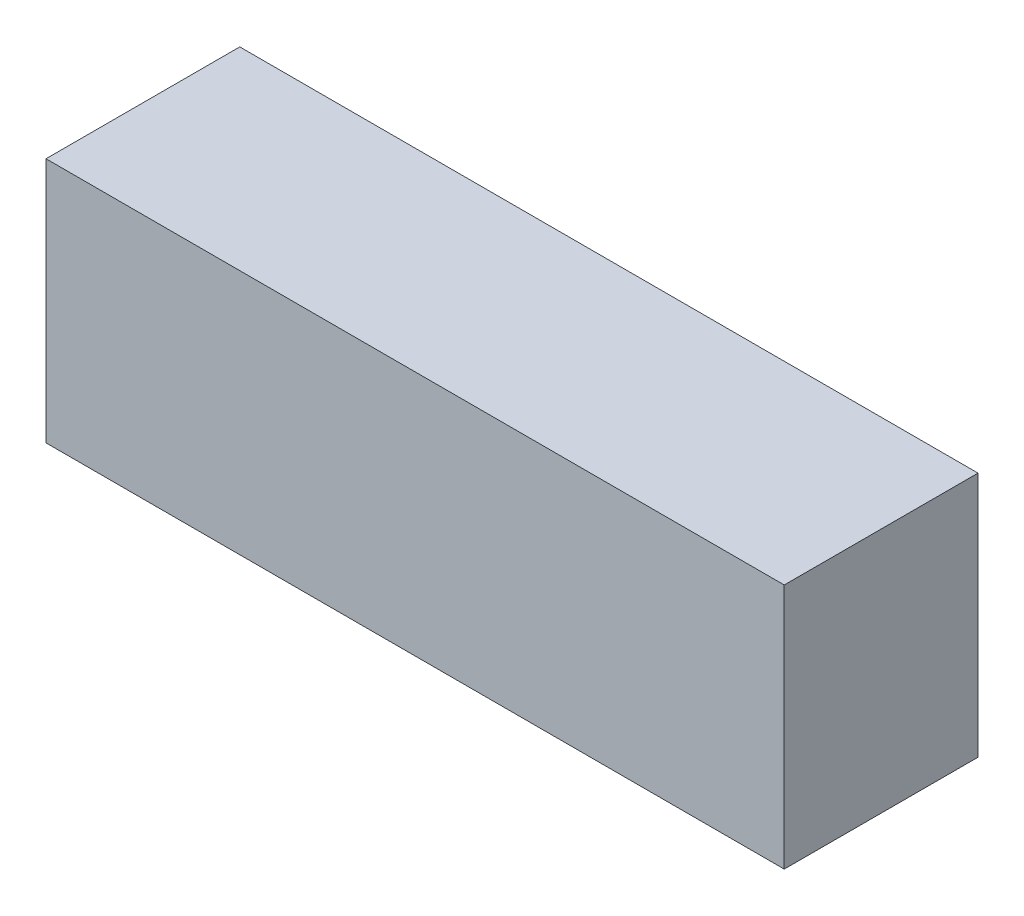
ISO-10303-21;
HEADER;
FILE_DESCRIPTION(('STEP AP214'),'2;1');
FILE_NAME('part.step','',(''),(''),'','','');
FILE_SCHEMA(('AUTOMOTIVE_DESIGN { 1 0 10303 214 1 1 1 1 }'));
ENDSEC;
DATA;
#1=APPLICATION_CONTEXT('core data for automotive mechanical design processes');
#2=APPLICATION_PROTOCOL_DEFINITION('international standard','automotive_design',2000,#1);
#3=PRODUCT_CONTEXT('',#1,'mechanical');
#4=PRODUCT('Part','Part','',(#3));
#5=PRODUCT_RELATED_PRODUCT_CATEGORY('part','',(#4));
#6=PRODUCT_DEFINITION_FORMATION('','',#4);
#7=PRODUCT_DEFINITION_CONTEXT('part definition',#1,'design');
#8=PRODUCT_DEFINITION('design','',#6,#7);
#9=PRODUCT_DEFINITION_SHAPE('','',#8);
#10=(LENGTH_UNIT() NAMED_UNIT(*) SI_UNIT(.MILLI.,.METRE.));
#11=(NAMED_UNIT(*) PLANE_ANGLE_UNIT() SI_UNIT($,.RADIAN.));
#12=(NAMED_UNIT(*) SI_UNIT($,.STERADIAN.) SOLID_ANGLE_UNIT());
#13=UNCERTAINTY_MEASURE_WITH_UNIT(LENGTH_MEASURE(1.E-05),#10,'distance_accuracy_value','');
#14=(GEOMETRIC_REPRESENTATION_CONTEXT(3) GLOBAL_UNCERTAINTY_ASSIGNED_CONTEXT((#13)) GLOBAL_UNIT_ASSIGNED_CONTEXT((#10,
#11,#12)) REPRESENTATION_CONTEXT('',''));
#15=CARTESIAN_POINT('',(0.,0.,0.));
#16=DIRECTION('',(0.,0.,1.));
#17=DIRECTION('',(1.,0.,0.));
#18=AXIS2_PLACEMENT_3D('',#15,#16,#17);
#19=CARTESIAN_POINT('',(1.905,0.635,1.));
#20=DIRECTION('',(0.,0.,1.));
#21=DIRECTION('',(1.,0.,0.));
#22=AXIS2_PLACEMENT_3D('',#19,#20,#21);
#23=PLANE('',#22);
#24=DIRECTION('',(1.,0.,0.));
#25=VECTOR('',#24,1.);
#26=CARTESIAN_POINT('',(1.905,-0.635,1.));
#27=LINE('',#26,#25);
#28=CARTESIAN_POINT('',(1.905,-0.635,1.));
#29=VERTEX_POINT('',#28);
#30=CARTESIAN_POINT('',(-1.905,-0.635,1.));
#31=VERTEX_POINT('',#30);
#32=EDGE_CURVE('E53',#29,#31,#27,.F.);
#33=ORIENTED_EDGE('',*,*,#32,.F.);
#34=DIRECTION('',(0.,1.,0.));
#35=VECTOR('',#34,1.);
#36=CARTESIAN_POINT('',(1.905,0.635,1.));
#37=LINE('',#36,#35);
#38=CARTESIAN_POINT('',(1.905,0.635,1.));
#39=VERTEX_POINT('',#38);
#40=EDGE_CURVE('E20',#29,#39,#37,.T.);
#41=ORIENTED_EDGE('',*,*,#40,.T.);
#42=DIRECTION('',(1.,0.,0.));
#43=VECTOR('',#42,1.);
#44=CARTESIAN_POINT('',(-1.905,0.635,1.));
#45=LINE('',#44,#43);
#46=CARTESIAN_POINT('',(-1.905,0.635,1.));
#47=VERTEX_POINT('',#46);
#48=EDGE_CURVE('E67',#47,#39,#45,.T.);
#49=ORIENTED_EDGE('',*,*,#48,.F.);
#50=DIRECTION('',(0.,1.,0.));
#51=VECTOR('',#50,1.);
#52=CARTESIAN_POINT('',(-1.905,-0.635,1.));
#53=LINE('',#52,#51);
#54=EDGE_CURVE('E58',#31,#47,#53,.T.);
#55=ORIENTED_EDGE('',*,*,#54,.F.);
#56=EDGE_LOOP('',(#33,#41,#49,#55));
#57=FACE_BOUND('',#56,.T.);
#58=ADVANCED_FACE('F17',(#57),#23,.T.);
#59=CARTESIAN_POINT('',(-1.905,0.635,0.));
#60=DIRECTION('',(0.,1.,0.));
#61=DIRECTION('',(0.,0.,1.));
#62=AXIS2_PLACEMENT_3D('',#59,#60,#61);
#63=PLANE('',#62);
#64=DIRECTION('',(0.,0.,-1.));
#65=VECTOR('',#64,1.);
#66=CARTESIAN_POINT('',(1.905,0.635,0.));
#67=LINE('',#66,#65);
#68=CARTESIAN_POINT('',(1.905,0.635,0.));
#69=VERTEX_POINT('',#68);
#70=EDGE_CURVE('E80',#69,#39,#67,.F.);
#71=ORIENTED_EDGE('',*,*,#70,.F.);
#72=DIRECTION('',(1.,0.,0.));
#73=VECTOR('',#72,1.);
#74=CARTESIAN_POINT('',(1.905,0.635,0.));
#75=LINE('',#74,#73);
#76=CARTESIAN_POINT('',(-1.905,0.635,0.));
#77=VERTEX_POINT('',#76);
#78=EDGE_CURVE('E75',#69,#77,#75,.F.);
#79=ORIENTED_EDGE('',*,*,#78,.T.);
#80=DIRECTION('',(0.,0.,1.));
#81=VECTOR('',#80,1.);
#82=CARTESIAN_POINT('',(-1.905,0.635,0.));
#83=LINE('',#82,#81);
#84=EDGE_CURVE('E63',#47,#77,#83,.F.);
#85=ORIENTED_EDGE('',*,*,#84,.F.);
#86=ORIENTED_EDGE('',*,*,#48,.T.);
#87=EDGE_LOOP('',(#71,#79,#85,#86));
#88=FACE_BOUND('',#87,.T.);
#89=ADVANCED_FACE('F74',(#88),#63,.T.);
#90=CARTESIAN_POINT('',(-1.905,-0.635,0.));
#91=DIRECTION('',(-1.,0.,0.));
#92=DIRECTION('',(0.,0.,1.));
#93=AXIS2_PLACEMENT_3D('',#90,#91,#92);
#94=PLANE('',#93);
#95=ORIENTED_EDGE('',*,*,#84,.T.);
#96=DIRECTION('',(0.,1.,0.));
#97=VECTOR('',#96,1.);
#98=CARTESIAN_POINT('',(-1.905,0.635,0.));
#99=LINE('',#98,#97);
#100=CARTESIAN_POINT('',(-1.905,-0.635,0.));
#101=VERTEX_POINT('',#100);
#102=EDGE_CURVE('E84',#77,#101,#99,.F.);
#103=ORIENTED_EDGE('',*,*,#102,.T.);
#104=DIRECTION('',(0.,0.,-1.));
#105=VECTOR('',#104,1.);
#106=CARTESIAN_POINT('',(-1.905,-0.635,0.));
#107=LINE('',#106,#105);
#108=EDGE_CURVE('E65',#31,#101,#107,.T.);
#109=ORIENTED_EDGE('',*,*,#108,.F.);
#110=ORIENTED_EDGE('',*,*,#54,.T.);
#111=EDGE_LOOP('',(#95,#103,#109,#110));
#112=FACE_BOUND('',#111,.T.);
#113=ADVANCED_FACE('F60',(#112),#94,.T.);
#114=CARTESIAN_POINT('',(1.905,-0.635,0.));
#115=DIRECTION('',(0.,-1.,0.));
#116=DIRECTION('',(0.,0.,-1.));
#117=AXIS2_PLACEMENT_3D('',#114,#115,#116);
#118=PLANE('',#117);
#119=ORIENTED_EDGE('',*,*,#108,.T.);
#120=DIRECTION('',(1.,0.,0.));
#121=VECTOR('',#120,1.);
#122=CARTESIAN_POINT('',(1.905,-0.635,0.));
#123=LINE('',#122,#121);
#124=CARTESIAN_POINT('',(1.905,-0.635,0.));
#125=VERTEX_POINT('',#124);
#126=EDGE_CURVE('E26',#101,#125,#123,.T.);
#127=ORIENTED_EDGE('',*,*,#126,.T.);
#128=DIRECTION('',(0.,0.,-1.));
#129=VECTOR('',#128,1.);
#130=CARTESIAN_POINT('',(1.905,-0.635,0.));
#131=LINE('',#130,#129);
#132=EDGE_CURVE('E34',#29,#125,#131,.T.);
#133=ORIENTED_EDGE('',*,*,#132,.F.);
#134=ORIENTED_EDGE('',*,*,#32,.T.);
#135=EDGE_LOOP('',(#119,#127,#133,#134));
#136=FACE_BOUND('',#135,.T.);
#137=ADVANCED_FACE('F88',(#136),#118,.T.);
#138=CARTESIAN_POINT('',(1.905,0.635,0.));
#139=DIRECTION('',(1.,0.,0.));
#140=DIRECTION('',(0.,0.,-1.));
#141=AXIS2_PLACEMENT_3D('',#138,#139,#140);
#142=PLANE('',#141);
#143=ORIENTED_EDGE('',*,*,#132,.T.);
#144=DIRECTION('',(0.,1.,0.));
#145=VECTOR('',#144,1.);
#146=CARTESIAN_POINT('',(1.905,0.635,0.));
#147=LINE('',#146,#145);
#148=EDGE_CURVE('E11',#125,#69,#147,.T.);
#149=ORIENTED_EDGE('',*,*,#148,.T.);
#150=ORIENTED_EDGE('',*,*,#70,.T.);
#151=ORIENTED_EDGE('',*,*,#40,.F.);
#152=EDGE_LOOP('',(#143,#149,#150,#151));
#153=FACE_BOUND('',#152,.T.);
#154=ADVANCED_FACE('F91',(#153),#142,.T.);
#155=CARTESIAN_POINT('',(1.905,0.635,0.));
#156=DIRECTION('',(0.,0.,1.));
#157=DIRECTION('',(1.,0.,0.));
#158=AXIS2_PLACEMENT_3D('',#155,#156,#157);
#159=PLANE('',#158);
#160=ORIENTED_EDGE('',*,*,#126,.F.);
#161=ORIENTED_EDGE('',*,*,#102,.F.);
#162=ORIENTED_EDGE('',*,*,#78,.F.);
#163=ORIENTED_EDGE('',*,*,#148,.F.);
#164=EDGE_LOOP('',(#160,#161,#162,#163));
#165=FACE_BOUND('',#164,.T.);
#166=ADVANCED_FACE('F90',(#165),#159,.F.);
#167=CLOSED_SHELL('',(#58,#89,#113,#137,#154,#166));
#168=MANIFOLD_SOLID_BREP('B1',#167);
#169=ADVANCED_BREP_SHAPE_REPRESENTATION('',(#18,#168),#14);
#170=SHAPE_DEFINITION_REPRESENTATION(#9,#169);
ENDSEC;
END-ISO-10303-21;
